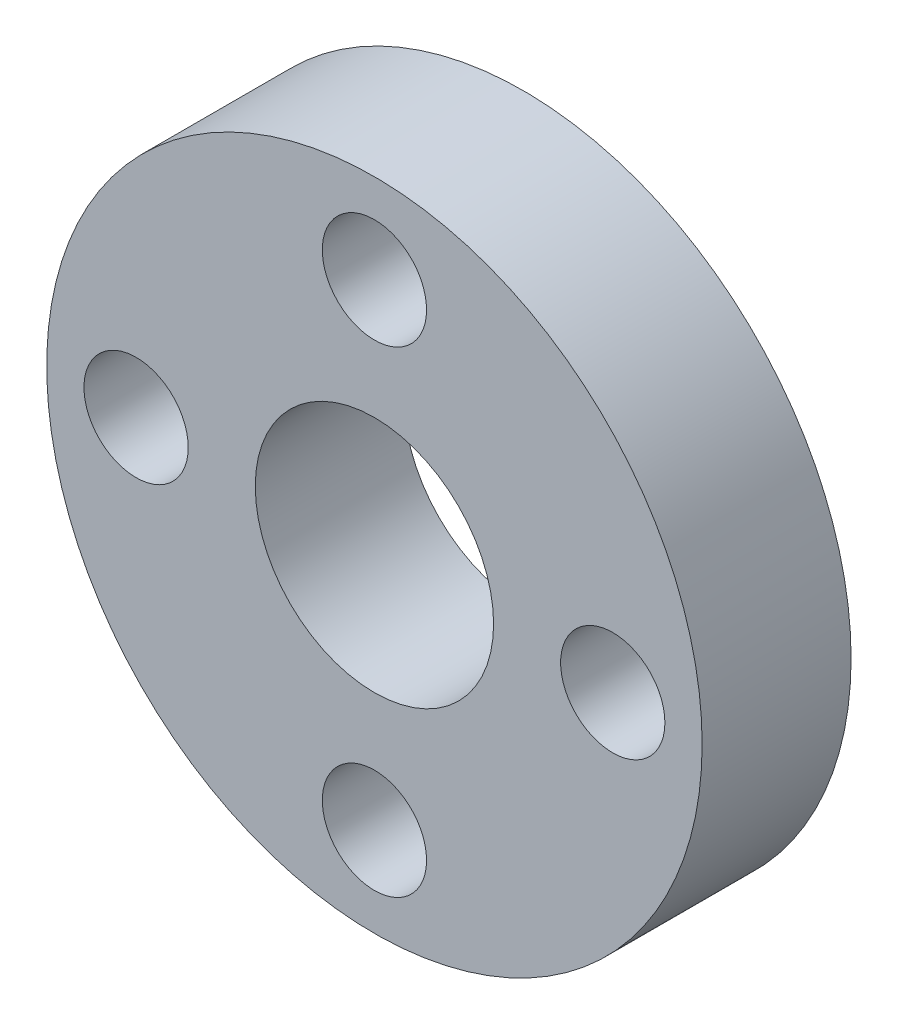
ISO-10303-21;
HEADER;
FILE_DESCRIPTION(('STEP AP214'),'2;1');
FILE_NAME('part.step','',(''),(''),'','','');
FILE_SCHEMA(('AUTOMOTIVE_DESIGN { 1 0 10303 214 1 1 1 1 }'));
ENDSEC;
DATA;
#1=APPLICATION_CONTEXT('core data for automotive mechanical design processes');
#2=APPLICATION_PROTOCOL_DEFINITION('international standard','automotive_design',2000,#1);
#3=PRODUCT_CONTEXT('',#1,'mechanical');
#4=PRODUCT('Part','Part','',(#3));
#5=PRODUCT_RELATED_PRODUCT_CATEGORY('part','',(#4));
#6=PRODUCT_DEFINITION_FORMATION('','',#4);
#7=PRODUCT_DEFINITION_CONTEXT('part definition',#1,'design');
#8=PRODUCT_DEFINITION('design','',#6,#7);
#9=PRODUCT_DEFINITION_SHAPE('','',#8);
#10=(LENGTH_UNIT() NAMED_UNIT(*) SI_UNIT(.MILLI.,.METRE.));
#11=(NAMED_UNIT(*) PLANE_ANGLE_UNIT() SI_UNIT($,.RADIAN.));
#12=(NAMED_UNIT(*) SI_UNIT($,.STERADIAN.) SOLID_ANGLE_UNIT());
#13=UNCERTAINTY_MEASURE_WITH_UNIT(LENGTH_MEASURE(1.E-05),#10,'distance_accuracy_value','');
#14=(GEOMETRIC_REPRESENTATION_CONTEXT(3) GLOBAL_UNCERTAINTY_ASSIGNED_CONTEXT((#13)) GLOBAL_UNIT_ASSIGNED_CONTEXT((#10,
#11,#12)) REPRESENTATION_CONTEXT('',''));
#15=CARTESIAN_POINT('',(0.,0.,0.));
#16=DIRECTION('',(0.,0.,1.));
#17=DIRECTION('',(1.,0.,0.));
#18=AXIS2_PLACEMENT_3D('',#15,#16,#17);
#19=CARTESIAN_POINT('',(0.,0.,5.));
#20=DIRECTION('',(0.,0.,1.));
#21=DIRECTION('',(1.,0.,0.));
#22=AXIS2_PLACEMENT_3D('',#19,#20,#21);
#23=PLANE('',#22);
#24=CARTESIAN_POINT('',(0.,0.,5.));
#25=DIRECTION('',(0.,0.,1.));
#26=DIRECTION('',(1.,0.,0.));
#27=AXIS2_PLACEMENT_3D('',#24,#25,#26);
#28=CIRCLE('',#27,4.);
#29=CARTESIAN_POINT('',(4.,0.,5.));
#30=VERTEX_POINT('',#29);
#31=EDGE_CURVE('E76',#30,#30,#28,.T.);
#32=ORIENTED_EDGE('',*,*,#31,.F.);
#33=EDGE_LOOP('',(#32));
#34=FACE_BOUND('',#33,.T.);
#35=CARTESIAN_POINT('',(0.,-8.,5.));
#36=DIRECTION('',(0.,0.,1.));
#37=DIRECTION('',(1.,0.,0.));
#38=AXIS2_PLACEMENT_3D('',#35,#36,#37);
#39=CIRCLE('',#38,1.75);
#40=CARTESIAN_POINT('',(1.75,-8.,5.));
#41=VERTEX_POINT('',#40);
#42=EDGE_CURVE('E62',#41,#41,#39,.T.);
#43=ORIENTED_EDGE('',*,*,#42,.F.);
#44=EDGE_LOOP('',(#43));
#45=FACE_BOUND('',#44,.T.);
#46=CARTESIAN_POINT('',(0.,8.,5.));
#47=DIRECTION('',(0.,0.,1.));
#48=DIRECTION('',(1.,0.,0.));
#49=AXIS2_PLACEMENT_3D('',#46,#47,#48);
#50=CIRCLE('',#49,1.75);
#51=CARTESIAN_POINT('',(1.75,8.,5.));
#52=VERTEX_POINT('',#51);
#53=EDGE_CURVE('E51',#52,#52,#50,.T.);
#54=ORIENTED_EDGE('',*,*,#53,.F.);
#55=EDGE_LOOP('',(#54));
#56=FACE_BOUND('',#55,.T.);
#57=CARTESIAN_POINT('',(0.,0.,5.));
#58=DIRECTION('',(0.,0.,1.));
#59=DIRECTION('',(1.,0.,0.));
#60=AXIS2_PLACEMENT_3D('',#57,#58,#59);
#61=CIRCLE('',#60,11.);
#62=CARTESIAN_POINT('',(11.,0.,5.));
#63=VERTEX_POINT('',#62);
#64=EDGE_CURVE('E10',#63,#63,#61,.T.);
#65=ORIENTED_EDGE('',*,*,#64,.T.);
#66=EDGE_LOOP('',(#65));
#67=FACE_BOUND('',#66,.T.);
#68=CARTESIAN_POINT('',(8.,0.,5.));
#69=DIRECTION('',(0.,0.,1.));
#70=DIRECTION('',(1.,0.,0.));
#71=AXIS2_PLACEMENT_3D('',#68,#69,#70);
#72=CIRCLE('',#71,1.75);
#73=CARTESIAN_POINT('',(9.75,0.,5.));
#74=VERTEX_POINT('',#73);
#75=EDGE_CURVE('E56',#74,#74,#72,.T.);
#76=ORIENTED_EDGE('',*,*,#75,.F.);
#77=EDGE_LOOP('',(#76));
#78=FACE_BOUND('',#77,.T.);
#79=CARTESIAN_POINT('',(-8.,0.,5.));
#80=DIRECTION('',(0.,0.,1.));
#81=DIRECTION('',(1.,0.,0.));
#82=AXIS2_PLACEMENT_3D('',#79,#80,#81);
#83=CIRCLE('',#82,1.75);
#84=CARTESIAN_POINT('',(-6.25,0.,5.));
#85=VERTEX_POINT('',#84);
#86=EDGE_CURVE('E68',#85,#85,#83,.T.);
#87=ORIENTED_EDGE('',*,*,#86,.F.);
#88=EDGE_LOOP('',(#87));
#89=FACE_BOUND('',#88,.T.);
#90=ADVANCED_FACE('F38',(#34,#45,#56,#67,#78,#89),#23,.T.);
#91=CARTESIAN_POINT('',(0.,0.,0.));
#92=DIRECTION('',(0.,0.,1.));
#93=DIRECTION('',(1.,0.,0.));
#94=AXIS2_PLACEMENT_3D('',#91,#92,#93);
#95=PLANE('',#94);
#96=CARTESIAN_POINT('',(0.,0.,0.));
#97=DIRECTION('',(0.,0.,1.));
#98=DIRECTION('',(1.,0.,0.));
#99=AXIS2_PLACEMENT_3D('',#96,#97,#98);
#100=CIRCLE('',#99,4.);
#101=CARTESIAN_POINT('',(4.,0.,0.));
#102=VERTEX_POINT('',#101);
#103=EDGE_CURVE('E42',#102,#102,#100,.T.);
#104=ORIENTED_EDGE('',*,*,#103,.T.);
#105=EDGE_LOOP('',(#104));
#106=FACE_BOUND('',#105,.T.);
#107=CARTESIAN_POINT('',(0.,0.,0.));
#108=DIRECTION('',(0.,0.,1.));
#109=DIRECTION('',(1.,0.,0.));
#110=AXIS2_PLACEMENT_3D('',#107,#108,#109);
#111=CIRCLE('',#110,11.);
#112=CARTESIAN_POINT('',(11.,0.,0.));
#113=VERTEX_POINT('',#112);
#114=EDGE_CURVE('E46',#113,#113,#111,.T.);
#115=ORIENTED_EDGE('',*,*,#114,.F.);
#116=EDGE_LOOP('',(#115));
#117=FACE_BOUND('',#116,.T.);
#118=CARTESIAN_POINT('',(0.,8.,0.));
#119=DIRECTION('',(0.,0.,1.));
#120=DIRECTION('',(1.,0.,0.));
#121=AXIS2_PLACEMENT_3D('',#118,#119,#120);
#122=CIRCLE('',#121,1.75);
#123=CARTESIAN_POINT('',(1.75,8.,0.));
#124=VERTEX_POINT('',#123);
#125=EDGE_CURVE('E53',#124,#124,#122,.T.);
#126=ORIENTED_EDGE('',*,*,#125,.T.);
#127=EDGE_LOOP('',(#126));
#128=FACE_BOUND('',#127,.T.);
#129=CARTESIAN_POINT('',(8.,0.,0.));
#130=DIRECTION('',(0.,0.,1.));
#131=DIRECTION('',(1.,0.,0.));
#132=AXIS2_PLACEMENT_3D('',#129,#130,#131);
#133=CIRCLE('',#132,1.75);
#134=CARTESIAN_POINT('',(9.75,0.,0.));
#135=VERTEX_POINT('',#134);
#136=EDGE_CURVE('E59',#135,#135,#133,.T.);
#137=ORIENTED_EDGE('',*,*,#136,.T.);
#138=EDGE_LOOP('',(#137));
#139=FACE_BOUND('',#138,.T.);
#140=CARTESIAN_POINT('',(0.,-8.,0.));
#141=DIRECTION('',(0.,0.,1.));
#142=DIRECTION('',(1.,0.,0.));
#143=AXIS2_PLACEMENT_3D('',#140,#141,#142);
#144=CIRCLE('',#143,1.75);
#145=CARTESIAN_POINT('',(1.75,-8.,0.));
#146=VERTEX_POINT('',#145);
#147=EDGE_CURVE('E65',#146,#146,#144,.T.);
#148=ORIENTED_EDGE('',*,*,#147,.T.);
#149=EDGE_LOOP('',(#148));
#150=FACE_BOUND('',#149,.T.);
#151=CARTESIAN_POINT('',(-8.,0.,0.));
#152=DIRECTION('',(0.,0.,1.));
#153=DIRECTION('',(1.,0.,0.));
#154=AXIS2_PLACEMENT_3D('',#151,#152,#153);
#155=CIRCLE('',#154,1.75);
#156=CARTESIAN_POINT('',(-6.25,0.,0.));
#157=VERTEX_POINT('',#156);
#158=EDGE_CURVE('E71',#157,#157,#155,.T.);
#159=ORIENTED_EDGE('',*,*,#158,.T.);
#160=EDGE_LOOP('',(#159));
#161=FACE_BOUND('',#160,.T.);
#162=ADVANCED_FACE('F83',(#106,#117,#128,#139,#150,#161),#95,.F.);
#163=CARTESIAN_POINT('',(0.,0.,5.));
#164=DIRECTION('',(0.,0.,-1.));
#165=DIRECTION('',(-1.,0.,0.));
#166=AXIS2_PLACEMENT_3D('',#163,#164,#165);
#167=CYLINDRICAL_SURFACE('',#166,11.);
#168=ORIENTED_EDGE('',*,*,#64,.F.);
#169=EDGE_LOOP('',(#168));
#170=FACE_BOUND('',#169,.T.);
#171=ORIENTED_EDGE('',*,*,#114,.T.);
#172=EDGE_LOOP('',(#171));
#173=FACE_BOUND('',#172,.T.);
#174=ADVANCED_FACE('F40',(#170,#173),#167,.T.);
#175=CARTESIAN_POINT('',(0.,8.,5.));
#176=DIRECTION('',(0.,0.,-1.));
#177=DIRECTION('',(-1.,0.,0.));
#178=AXIS2_PLACEMENT_3D('',#175,#176,#177);
#179=CYLINDRICAL_SURFACE('',#178,1.75);
#180=ORIENTED_EDGE('',*,*,#53,.T.);
#181=EDGE_LOOP('',(#180));
#182=FACE_BOUND('',#181,.T.);
#183=ORIENTED_EDGE('',*,*,#125,.F.);
#184=EDGE_LOOP('',(#183));
#185=FACE_BOUND('',#184,.T.);
#186=ADVANCED_FACE('F104',(#182,#185),#179,.F.);
#187=CARTESIAN_POINT('',(8.,0.,5.));
#188=DIRECTION('',(0.,0.,-1.));
#189=DIRECTION('',(-1.,0.,0.));
#190=AXIS2_PLACEMENT_3D('',#187,#188,#189);
#191=CYLINDRICAL_SURFACE('',#190,1.75);
#192=ORIENTED_EDGE('',*,*,#75,.T.);
#193=EDGE_LOOP('',(#192));
#194=FACE_BOUND('',#193,.T.);
#195=ORIENTED_EDGE('',*,*,#136,.F.);
#196=EDGE_LOOP('',(#195));
#197=FACE_BOUND('',#196,.T.);
#198=ADVANCED_FACE('F107',(#194,#197),#191,.F.);
#199=CARTESIAN_POINT('',(0.,-8.,5.));
#200=DIRECTION('',(0.,0.,-1.));
#201=DIRECTION('',(-1.,0.,0.));
#202=AXIS2_PLACEMENT_3D('',#199,#200,#201);
#203=CYLINDRICAL_SURFACE('',#202,1.75);
#204=ORIENTED_EDGE('',*,*,#42,.T.);
#205=EDGE_LOOP('',(#204));
#206=FACE_BOUND('',#205,.T.);
#207=ORIENTED_EDGE('',*,*,#147,.F.);
#208=EDGE_LOOP('',(#207));
#209=FACE_BOUND('',#208,.T.);
#210=ADVANCED_FACE('F93',(#206,#209),#203,.F.);
#211=CARTESIAN_POINT('',(-8.,0.,5.));
#212=DIRECTION('',(0.,0.,-1.));
#213=DIRECTION('',(-1.,0.,0.));
#214=AXIS2_PLACEMENT_3D('',#211,#212,#213);
#215=CYLINDRICAL_SURFACE('',#214,1.75);
#216=ORIENTED_EDGE('',*,*,#86,.T.);
#217=EDGE_LOOP('',(#216));
#218=FACE_BOUND('',#217,.T.);
#219=ORIENTED_EDGE('',*,*,#158,.F.);
#220=EDGE_LOOP('',(#219));
#221=FACE_BOUND('',#220,.T.);
#222=ADVANCED_FACE('F88',(#218,#221),#215,.F.);
#223=CARTESIAN_POINT('',(0.,0.,-5.));
#224=DIRECTION('',(0.,0.,1.));
#225=DIRECTION('',(1.,0.,0.));
#226=AXIS2_PLACEMENT_3D('',#223,#224,#225);
#227=CYLINDRICAL_SURFACE('',#226,4.);
#228=ORIENTED_EDGE('',*,*,#31,.T.);
#229=EDGE_LOOP('',(#228));
#230=FACE_BOUND('',#229,.T.);
#231=ORIENTED_EDGE('',*,*,#103,.F.);
#232=EDGE_LOOP('',(#231));
#233=FACE_BOUND('',#232,.T.);
#234=ADVANCED_FACE('F86',(#230,#233),#227,.F.);
#235=CLOSED_SHELL('',(#90,#162,#174,#186,#198,#210,#222,#234));
#236=MANIFOLD_SOLID_BREP('B2',#235);
#237=ADVANCED_BREP_SHAPE_REPRESENTATION('',(#18,#236),#14);
#238=SHAPE_DEFINITION_REPRESENTATION(#9,#237);
ENDSEC;
END-ISO-10303-21;
